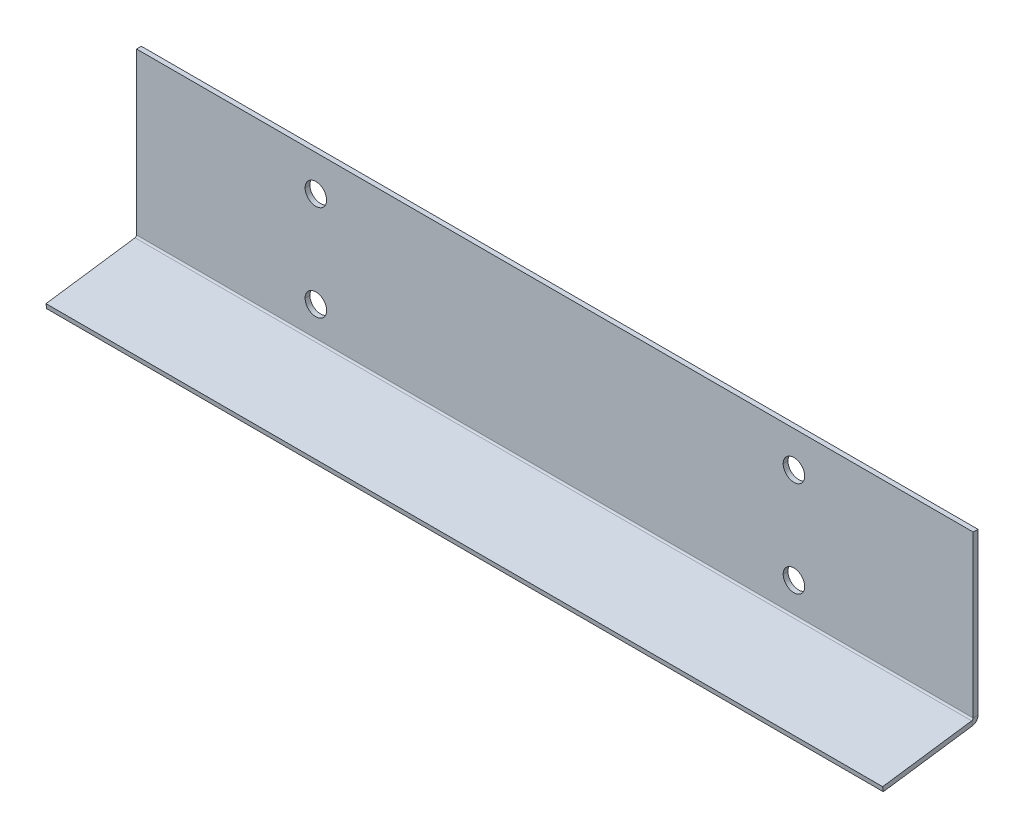
ISO-10303-21;
HEADER;
FILE_DESCRIPTION(('STEP AP214'),'2;1');
FILE_NAME('part.step','',(''),(''),'','','');
FILE_SCHEMA(('AUTOMOTIVE_DESIGN { 1 0 10303 214 1 1 1 1 }'));
ENDSEC;
DATA;
#1=APPLICATION_CONTEXT('core data for automotive mechanical design processes');
#2=APPLICATION_PROTOCOL_DEFINITION('international standard','automotive_design',2000,#1);
#3=PRODUCT_CONTEXT('',#1,'mechanical');
#4=PRODUCT('Part','Part','',(#3));
#5=PRODUCT_RELATED_PRODUCT_CATEGORY('part','',(#4));
#6=PRODUCT_DEFINITION_FORMATION('','',#4);
#7=PRODUCT_DEFINITION_CONTEXT('part definition',#1,'design');
#8=PRODUCT_DEFINITION('design','',#6,#7);
#9=PRODUCT_DEFINITION_SHAPE('','',#8);
#10=(LENGTH_UNIT() NAMED_UNIT(*) SI_UNIT(.MILLI.,.METRE.));
#11=(NAMED_UNIT(*) PLANE_ANGLE_UNIT() SI_UNIT($,.RADIAN.));
#12=(NAMED_UNIT(*) SI_UNIT($,.STERADIAN.) SOLID_ANGLE_UNIT());
#13=UNCERTAINTY_MEASURE_WITH_UNIT(LENGTH_MEASURE(1.E-05),#10,'distance_accuracy_value','');
#14=(GEOMETRIC_REPRESENTATION_CONTEXT(3) GLOBAL_UNCERTAINTY_ASSIGNED_CONTEXT((#13)) GLOBAL_UNIT_ASSIGNED_CONTEXT((#10,
#11,#12)) REPRESENTATION_CONTEXT('',''));
#15=CARTESIAN_POINT('',(0.,0.,0.));
#16=DIRECTION('',(0.,0.,1.));
#17=DIRECTION('',(1.,0.,0.));
#18=AXIS2_PLACEMENT_3D('',#15,#16,#17);
#19=CARTESIAN_POINT('',(-100.,20.,0.));
#20=DIRECTION('',(0.,0.,1.));
#21=DIRECTION('',(1.,0.,0.));
#22=AXIS2_PLACEMENT_3D('',#19,#20,#21);
#23=CYLINDRICAL_SURFACE('',#22,4.5);
#24=CARTESIAN_POINT('',(-100.,20.,-2.));
#25=DIRECTION('',(0.,0.,1.));
#26=DIRECTION('',(1.,0.,0.));
#27=AXIS2_PLACEMENT_3D('',#24,#25,#26);
#28=CIRCLE('',#27,4.5);
#29=CARTESIAN_POINT('',(-104.5,20.,-2.));
#30=VERTEX_POINT('',#29);
#31=CARTESIAN_POINT('',(-95.5,20.,-2.));
#32=VERTEX_POINT('',#31);
#33=EDGE_CURVE('E41',#30,#32,#28,.T.);
#34=ORIENTED_EDGE('',*,*,#33,.F.);
#35=DIRECTION('',(0.,0.,1.));
#36=VECTOR('',#35,1.);
#37=CARTESIAN_POINT('',(-104.5,20.,0.));
#38=LINE('',#37,#36);
#39=CARTESIAN_POINT('',(-104.5,20.,0.));
#40=VERTEX_POINT('',#39);
#41=EDGE_CURVE('E11',#30,#40,#38,.T.);
#42=ORIENTED_EDGE('',*,*,#41,.T.);
#43=CARTESIAN_POINT('',(-100.,20.,0.));
#44=DIRECTION('',(0.,0.,1.));
#45=DIRECTION('',(1.,0.,0.));
#46=AXIS2_PLACEMENT_3D('',#43,#44,#45);
#47=CIRCLE('',#46,4.5);
#48=CARTESIAN_POINT('',(-95.5,20.,0.));
#49=VERTEX_POINT('',#48);
#50=EDGE_CURVE('E27',#40,#49,#47,.T.);
#51=ORIENTED_EDGE('',*,*,#50,.T.);
#52=DIRECTION('',(0.,0.,1.));
#53=VECTOR('',#52,1.);
#54=CARTESIAN_POINT('',(-95.5,20.,0.));
#55=LINE('',#54,#53);
#56=EDGE_CURVE('E198',#32,#49,#55,.T.);
#57=ORIENTED_EDGE('',*,*,#56,.F.);
#58=EDGE_LOOP('',(#34,#42,#51,#57));
#59=FACE_BOUND('',#58,.T.);
#60=ADVANCED_FACE('F16',(#59),#23,.F.);
#61=CARTESIAN_POINT('',(-100.,-20.,0.));
#62=DIRECTION('',(0.,0.,1.));
#63=DIRECTION('',(1.,0.,0.));
#64=AXIS2_PLACEMENT_3D('',#61,#62,#63);
#65=CYLINDRICAL_SURFACE('',#64,4.5);
#66=CARTESIAN_POINT('',(-100.,-20.,-2.));
#67=DIRECTION('',(0.,0.,1.));
#68=DIRECTION('',(1.,0.,0.));
#69=AXIS2_PLACEMENT_3D('',#66,#67,#68);
#70=CIRCLE('',#69,4.5);
#71=CARTESIAN_POINT('',(-104.5,-20.,-2.));
#72=VERTEX_POINT('',#71);
#73=CARTESIAN_POINT('',(-95.5,-20.,-2.));
#74=VERTEX_POINT('',#73);
#75=EDGE_CURVE('E225',#72,#74,#70,.T.);
#76=ORIENTED_EDGE('',*,*,#75,.F.);
#77=DIRECTION('',(0.,0.,1.));
#78=VECTOR('',#77,1.);
#79=CARTESIAN_POINT('',(-104.5,-20.,0.));
#80=LINE('',#79,#78);
#81=CARTESIAN_POINT('',(-104.5,-20.,0.));
#82=VERTEX_POINT('',#81);
#83=EDGE_CURVE('E174',#72,#82,#80,.T.);
#84=ORIENTED_EDGE('',*,*,#83,.T.);
#85=CARTESIAN_POINT('',(-100.,-20.,0.));
#86=DIRECTION('',(0.,0.,1.));
#87=DIRECTION('',(1.,0.,0.));
#88=AXIS2_PLACEMENT_3D('',#85,#86,#87);
#89=CIRCLE('',#88,4.5);
#90=CARTESIAN_POINT('',(-95.5,-20.,0.));
#91=VERTEX_POINT('',#90);
#92=EDGE_CURVE('E178',#82,#91,#89,.T.);
#93=ORIENTED_EDGE('',*,*,#92,.T.);
#94=DIRECTION('',(0.,0.,1.));
#95=VECTOR('',#94,1.);
#96=CARTESIAN_POINT('',(-95.5,-20.,0.));
#97=LINE('',#96,#95);
#98=EDGE_CURVE('E197',#74,#91,#97,.T.);
#99=ORIENTED_EDGE('',*,*,#98,.F.);
#100=EDGE_LOOP('',(#76,#84,#93,#99));
#101=FACE_BOUND('',#100,.T.);
#102=ADVANCED_FACE('F647',(#101),#65,.F.);
#103=CARTESIAN_POINT('',(100.,-20.,0.));
#104=DIRECTION('',(0.,0.,1.));
#105=DIRECTION('',(1.,0.,0.));
#106=AXIS2_PLACEMENT_3D('',#103,#104,#105);
#107=CYLINDRICAL_SURFACE('',#106,4.5);
#108=CARTESIAN_POINT('',(100.,-20.,-2.));
#109=DIRECTION('',(0.,0.,1.));
#110=DIRECTION('',(1.,0.,0.));
#111=AXIS2_PLACEMENT_3D('',#108,#109,#110);
#112=CIRCLE('',#111,4.5);
#113=CARTESIAN_POINT('',(95.5,-20.,-2.));
#114=VERTEX_POINT('',#113);
#115=CARTESIAN_POINT('',(104.5,-20.,-2.));
#116=VERTEX_POINT('',#115);
#117=EDGE_CURVE('E226',#114,#116,#112,.T.);
#118=ORIENTED_EDGE('',*,*,#117,.F.);
#119=DIRECTION('',(0.,0.,1.));
#120=VECTOR('',#119,1.);
#121=CARTESIAN_POINT('',(95.5,-20.,0.));
#122=LINE('',#121,#120);
#123=CARTESIAN_POINT('',(95.5,-20.,0.));
#124=VERTEX_POINT('',#123);
#125=EDGE_CURVE('E182',#114,#124,#122,.T.);
#126=ORIENTED_EDGE('',*,*,#125,.T.);
#127=CARTESIAN_POINT('',(100.,-20.,0.));
#128=DIRECTION('',(0.,0.,1.));
#129=DIRECTION('',(1.,0.,0.));
#130=AXIS2_PLACEMENT_3D('',#127,#128,#129);
#131=CIRCLE('',#130,4.5);
#132=CARTESIAN_POINT('',(104.5,-20.,0.));
#133=VERTEX_POINT('',#132);
#134=EDGE_CURVE('E179',#124,#133,#131,.T.);
#135=ORIENTED_EDGE('',*,*,#134,.T.);
#136=DIRECTION('',(0.,0.,1.));
#137=VECTOR('',#136,1.);
#138=CARTESIAN_POINT('',(104.5,-20.,0.));
#139=LINE('',#138,#137);
#140=EDGE_CURVE('E217',#116,#133,#139,.T.);
#141=ORIENTED_EDGE('',*,*,#140,.F.);
#142=EDGE_LOOP('',(#118,#126,#135,#141));
#143=FACE_BOUND('',#142,.T.);
#144=ADVANCED_FACE('F18',(#143),#107,.F.);
#145=CARTESIAN_POINT('',(100.,20.,0.));
#146=DIRECTION('',(0.,0.,1.));
#147=DIRECTION('',(1.,0.,0.));
#148=AXIS2_PLACEMENT_3D('',#145,#146,#147);
#149=CYLINDRICAL_SURFACE('',#148,4.5);
#150=CARTESIAN_POINT('',(100.,20.,-2.));
#151=DIRECTION('',(0.,0.,1.));
#152=DIRECTION('',(1.,0.,0.));
#153=AXIS2_PLACEMENT_3D('',#150,#151,#152);
#154=CIRCLE('',#153,4.5);
#155=CARTESIAN_POINT('',(95.5,20.,-2.));
#156=VERTEX_POINT('',#155);
#157=CARTESIAN_POINT('',(104.5,20.,-2.));
#158=VERTEX_POINT('',#157);
#159=EDGE_CURVE('E187',#156,#158,#154,.T.);
#160=ORIENTED_EDGE('',*,*,#159,.F.);
#161=DIRECTION('',(0.,0.,1.));
#162=VECTOR('',#161,1.);
#163=CARTESIAN_POINT('',(95.5,20.,0.));
#164=LINE('',#163,#162);
#165=CARTESIAN_POINT('',(95.5,20.,0.));
#166=VERTEX_POINT('',#165);
#167=EDGE_CURVE('E183',#156,#166,#164,.T.);
#168=ORIENTED_EDGE('',*,*,#167,.T.);
#169=CARTESIAN_POINT('',(100.,20.,0.));
#170=DIRECTION('',(0.,0.,1.));
#171=DIRECTION('',(1.,0.,0.));
#172=AXIS2_PLACEMENT_3D('',#169,#170,#171);
#173=CIRCLE('',#172,4.5);
#174=CARTESIAN_POINT('',(104.5,20.,0.));
#175=VERTEX_POINT('',#174);
#176=EDGE_CURVE('E203',#166,#175,#173,.T.);
#177=ORIENTED_EDGE('',*,*,#176,.T.);
#178=DIRECTION('',(0.,0.,1.));
#179=VECTOR('',#178,1.);
#180=CARTESIAN_POINT('',(104.5,20.,0.));
#181=LINE('',#180,#179);
#182=EDGE_CURVE('E167',#158,#175,#181,.T.);
#183=ORIENTED_EDGE('',*,*,#182,.F.);
#184=EDGE_LOOP('',(#160,#168,#177,#183));
#185=FACE_BOUND('',#184,.T.);
#186=ADVANCED_FACE('F601',(#185),#149,.F.);
#187=CARTESIAN_POINT('',(175.,-35.,-2.));
#188=DIRECTION('',(1.,0.,0.));
#189=DIRECTION('',(0.,1.,0.));
#190=AXIS2_PLACEMENT_3D('',#187,#188,#189);
#191=PLANE('',#190);
#192=DIRECTION('',(0.,1.,0.));
#193=VECTOR('',#192,1.);
#194=CARTESIAN_POINT('',(175.,-35.,0.));
#195=LINE('',#194,#193);
#196=CARTESIAN_POINT('',(175.,-32.3400282438874,0.));
#197=VERTEX_POINT('',#196);
#198=CARTESIAN_POINT('',(175.,35.,0.));
#199=VERTEX_POINT('',#198);
#200=EDGE_CURVE('E188',#197,#199,#195,.T.);
#201=ORIENTED_EDGE('',*,*,#200,.F.);
#202=DIRECTION('',(0.,0.,-1.));
#203=VECTOR('',#202,1.);
#204=CARTESIAN_POINT('',(175.,-32.3400282438874,0.));
#205=LINE('',#204,#203);
#206=CARTESIAN_POINT('',(175.,-32.3400282438873,-2.));
#207=VERTEX_POINT('',#206);
#208=EDGE_CURVE('E199',#197,#207,#205,.T.);
#209=ORIENTED_EDGE('',*,*,#208,.T.);
#210=DIRECTION('',(0.,1.,0.));
#211=VECTOR('',#210,1.);
#212=CARTESIAN_POINT('',(175.,-35.,-2.));
#213=LINE('',#212,#211);
#214=CARTESIAN_POINT('',(175.,35.,-2.));
#215=VERTEX_POINT('',#214);
#216=EDGE_CURVE('E204',#207,#215,#213,.T.);
#217=ORIENTED_EDGE('',*,*,#216,.T.);
#218=DIRECTION('',(0.,0.,1.));
#219=VECTOR('',#218,1.);
#220=CARTESIAN_POINT('',(175.,35.,-2.));
#221=LINE('',#220,#219);
#222=EDGE_CURVE('E133',#215,#199,#221,.T.);
#223=ORIENTED_EDGE('',*,*,#222,.T.);
#224=EDGE_LOOP('',(#201,#209,#217,#223));
#225=FACE_BOUND('',#224,.T.);
#226=ADVANCED_FACE('F281',(#225),#191,.T.);
#227=CARTESIAN_POINT('',(0.,0.,-2.));
#228=DIRECTION('',(0.,0.,1.));
#229=DIRECTION('',(1.,0.,0.));
#230=AXIS2_PLACEMENT_3D('',#227,#228,#229);
#231=PLANE('',#230);
#232=DIRECTION('',(-1.,0.,0.));
#233=VECTOR('',#232,1.);
#234=CARTESIAN_POINT('',(175.,-32.3400282438873,-2.));
#235=LINE('',#234,#233);
#236=CARTESIAN_POINT('',(-175.,-32.3400282438874,-2.));
#237=VERTEX_POINT('',#236);
#238=EDGE_CURVE('E145',#207,#237,#235,.T.);
#239=ORIENTED_EDGE('',*,*,#238,.T.);
#240=DIRECTION('',(0.,-1.,0.));
#241=VECTOR('',#240,1.);
#242=CARTESIAN_POINT('',(-175.,-35.,-2.));
#243=LINE('',#242,#241);
#244=CARTESIAN_POINT('',(-175.,35.,-2.));
#245=VERTEX_POINT('',#244);
#246=EDGE_CURVE('E138',#245,#237,#243,.T.);
#247=ORIENTED_EDGE('',*,*,#246,.F.);
#248=DIRECTION('',(-1.,0.,0.));
#249=VECTOR('',#248,1.);
#250=CARTESIAN_POINT('',(175.,35.,-2.));
#251=LINE('',#250,#249);
#252=EDGE_CURVE('E126',#215,#245,#251,.T.);
#253=ORIENTED_EDGE('',*,*,#252,.F.);
#254=ORIENTED_EDGE('',*,*,#216,.F.);
#255=EDGE_LOOP('',(#239,#247,#253,#254));
#256=FACE_BOUND('',#255,.T.);
#257=CARTESIAN_POINT('',(-100.,20.,-2.));
#258=DIRECTION('',(0.,0.,1.));
#259=DIRECTION('',(1.,0.,0.));
#260=AXIS2_PLACEMENT_3D('',#257,#258,#259);
#261=CIRCLE('',#260,4.5);
#262=EDGE_CURVE('E263',#32,#30,#261,.T.);
#263=ORIENTED_EDGE('',*,*,#262,.T.);
#264=ORIENTED_EDGE('',*,*,#33,.T.);
#265=EDGE_LOOP('',(#263,#264));
#266=FACE_BOUND('',#265,.T.);
#267=CARTESIAN_POINT('',(-100.,-20.,-2.));
#268=DIRECTION('',(0.,0.,1.));
#269=DIRECTION('',(1.,0.,0.));
#270=AXIS2_PLACEMENT_3D('',#267,#268,#269);
#271=CIRCLE('',#270,4.5);
#272=EDGE_CURVE('E266',#74,#72,#271,.T.);
#273=ORIENTED_EDGE('',*,*,#272,.T.);
#274=ORIENTED_EDGE('',*,*,#75,.T.);
#275=EDGE_LOOP('',(#273,#274));
#276=FACE_BOUND('',#275,.T.);
#277=CARTESIAN_POINT('',(100.,-20.,-2.));
#278=DIRECTION('',(0.,0.,1.));
#279=DIRECTION('',(1.,0.,0.));
#280=AXIS2_PLACEMENT_3D('',#277,#278,#279);
#281=CIRCLE('',#280,4.5);
#282=EDGE_CURVE('E221',#116,#114,#281,.T.);
#283=ORIENTED_EDGE('',*,*,#282,.T.);
#284=ORIENTED_EDGE('',*,*,#117,.T.);
#285=EDGE_LOOP('',(#283,#284));
#286=FACE_BOUND('',#285,.T.);
#287=CARTESIAN_POINT('',(100.,20.,-2.));
#288=DIRECTION('',(0.,0.,1.));
#289=DIRECTION('',(1.,0.,0.));
#290=AXIS2_PLACEMENT_3D('',#287,#288,#289);
#291=CIRCLE('',#290,4.5);
#292=EDGE_CURVE('E245',#158,#156,#291,.T.);
#293=ORIENTED_EDGE('',*,*,#292,.T.);
#294=ORIENTED_EDGE('',*,*,#159,.T.);
#295=EDGE_LOOP('',(#293,#294));
#296=FACE_BOUND('',#295,.T.);
#297=ADVANCED_FACE('F142',(#256,#266,#276,#286,#296),#231,.F.);
#298=CARTESIAN_POINT('',(0.,0.,0.));
#299=DIRECTION('',(0.,0.,1.));
#300=DIRECTION('',(1.,0.,0.));
#301=AXIS2_PLACEMENT_3D('',#298,#299,#300);
#302=PLANE('',#301);
#303=DIRECTION('',(0.,-1.,0.));
#304=VECTOR('',#303,1.);
#305=CARTESIAN_POINT('',(-175.,-35.,0.));
#306=LINE('',#305,#304);
#307=CARTESIAN_POINT('',(-175.,35.,0.));
#308=VERTEX_POINT('',#307);
#309=CARTESIAN_POINT('',(-175.,-32.3400282438874,0.));
#310=VERTEX_POINT('',#309);
#311=EDGE_CURVE('E155',#308,#310,#306,.T.);
#312=ORIENTED_EDGE('',*,*,#311,.T.);
#313=DIRECTION('',(-1.,0.,0.));
#314=VECTOR('',#313,1.);
#315=CARTESIAN_POINT('',(175.,-32.3400282438874,0.));
#316=LINE('',#315,#314);
#317=EDGE_CURVE('E169',#197,#310,#316,.T.);
#318=ORIENTED_EDGE('',*,*,#317,.F.);
#319=ORIENTED_EDGE('',*,*,#200,.T.);
#320=DIRECTION('',(-1.,0.,0.));
#321=VECTOR('',#320,1.);
#322=CARTESIAN_POINT('',(175.,35.,0.));
#323=LINE('',#322,#321);
#324=EDGE_CURVE('E150',#199,#308,#323,.T.);
#325=ORIENTED_EDGE('',*,*,#324,.T.);
#326=EDGE_LOOP('',(#312,#318,#319,#325));
#327=FACE_BOUND('',#326,.T.);
#328=CARTESIAN_POINT('',(-100.,20.,0.));
#329=DIRECTION('',(0.,0.,1.));
#330=DIRECTION('',(1.,0.,0.));
#331=AXIS2_PLACEMENT_3D('',#328,#329,#330);
#332=CIRCLE('',#331,4.5);
#333=EDGE_CURVE('E252',#49,#40,#332,.T.);
#334=ORIENTED_EDGE('',*,*,#333,.F.);
#335=ORIENTED_EDGE('',*,*,#50,.F.);
#336=EDGE_LOOP('',(#334,#335));
#337=FACE_BOUND('',#336,.T.);
#338=CARTESIAN_POINT('',(-100.,-20.,0.));
#339=DIRECTION('',(0.,0.,1.));
#340=DIRECTION('',(1.,0.,0.));
#341=AXIS2_PLACEMENT_3D('',#338,#339,#340);
#342=CIRCLE('',#341,4.5);
#343=EDGE_CURVE('E193',#91,#82,#342,.T.);
#344=ORIENTED_EDGE('',*,*,#343,.F.);
#345=ORIENTED_EDGE('',*,*,#92,.F.);
#346=EDGE_LOOP('',(#344,#345));
#347=FACE_BOUND('',#346,.T.);
#348=CARTESIAN_POINT('',(100.,-20.,0.));
#349=DIRECTION('',(0.,0.,1.));
#350=DIRECTION('',(1.,0.,0.));
#351=AXIS2_PLACEMENT_3D('',#348,#349,#350);
#352=CIRCLE('',#351,4.5);
#353=EDGE_CURVE('E213',#133,#124,#352,.T.);
#354=ORIENTED_EDGE('',*,*,#353,.F.);
#355=ORIENTED_EDGE('',*,*,#134,.F.);
#356=EDGE_LOOP('',(#354,#355));
#357=FACE_BOUND('',#356,.T.);
#358=CARTESIAN_POINT('',(100.,20.,0.));
#359=DIRECTION('',(0.,0.,1.));
#360=DIRECTION('',(1.,0.,0.));
#361=AXIS2_PLACEMENT_3D('',#358,#359,#360);
#362=CIRCLE('',#361,4.5);
#363=EDGE_CURVE('E313',#175,#166,#362,.T.);
#364=ORIENTED_EDGE('',*,*,#363,.F.);
#365=ORIENTED_EDGE('',*,*,#176,.F.);
#366=EDGE_LOOP('',(#364,#365));
#367=FACE_BOUND('',#366,.T.);
#368=ADVANCED_FACE('F277',(#327,#337,#347,#357,#367),#302,.T.);
#369=CARTESIAN_POINT('',(-175.,-35.,-2.));
#370=DIRECTION('',(-1.,0.,0.));
#371=DIRECTION('',(0.,0.,1.));
#372=AXIS2_PLACEMENT_3D('',#369,#370,#371);
#373=PLANE('',#372);
#374=DIRECTION('',(0.,0.,-1.));
#375=VECTOR('',#374,1.);
#376=CARTESIAN_POINT('',(-175.,-32.3400282438874,0.));
#377=LINE('',#376,#375);
#378=EDGE_CURVE('E157',#310,#237,#377,.T.);
#379=ORIENTED_EDGE('',*,*,#378,.F.);
#380=ORIENTED_EDGE('',*,*,#311,.F.);
#381=DIRECTION('',(0.,0.,1.));
#382=VECTOR('',#381,1.);
#383=CARTESIAN_POINT('',(-175.,35.,-2.));
#384=LINE('',#383,#382);
#385=EDGE_CURVE('E131',#245,#308,#384,.T.);
#386=ORIENTED_EDGE('',*,*,#385,.F.);
#387=ORIENTED_EDGE('',*,*,#246,.T.);
#388=EDGE_LOOP('',(#379,#380,#386,#387));
#389=FACE_BOUND('',#388,.T.);
#390=ADVANCED_FACE('F153',(#389),#373,.T.);
#391=CARTESIAN_POINT('',(175.,35.,-2.));
#392=DIRECTION('',(0.,1.,0.));
#393=DIRECTION('',(1.,0.,0.));
#394=AXIS2_PLACEMENT_3D('',#391,#392,#393);
#395=PLANE('',#394);
#396=ORIENTED_EDGE('',*,*,#324,.F.);
#397=ORIENTED_EDGE('',*,*,#222,.F.);
#398=ORIENTED_EDGE('',*,*,#252,.T.);
#399=ORIENTED_EDGE('',*,*,#385,.T.);
#400=EDGE_LOOP('',(#396,#397,#398,#399));
#401=FACE_BOUND('',#400,.T.);
#402=ADVANCED_FACE('F129',(#401),#395,.T.);
#403=CARTESIAN_POINT('',(-175.,-32.3400282438874,0.736599999999989));
#404=DIRECTION('',(-1.,0.,0.));
#405=DIRECTION('',(0.,0.,1.));
#406=AXIS2_PLACEMENT_3D('',#403,#404,#405);
#407=PLANE('',#406);
#408=DIRECTION('',(0.,-0.99026806874157,-0.139173100960069));
#409=VECTOR('',#408,1.);
#410=CARTESIAN_POINT('',(-175.,-35.0499958408056,0.355738891912671));
#411=LINE('',#410,#409);
#412=CARTESIAN_POINT('',(-175.,-33.0694597033225,0.634085093832799));
#413=VERTEX_POINT('',#412);
#414=CARTESIAN_POINT('',(-175.,-35.0499958408056,0.355738891912661));
#415=VERTEX_POINT('',#414);
#416=EDGE_CURVE('E244',#413,#415,#411,.T.);
#417=ORIENTED_EDGE('',*,*,#416,.F.);
#418=CARTESIAN_POINT('',(-175.,-32.3400282438874,0.736599999999989));
#419=DIRECTION('',(-1.,0.,0.));
#420=DIRECTION('',(0.,0.,-1.));
#421=AXIS2_PLACEMENT_3D('',#418,#419,#420);
#422=CIRCLE('',#421,0.736600000000021);
#423=EDGE_CURVE('E173',#310,#413,#422,.T.);
#424=ORIENTED_EDGE('',*,*,#423,.F.);
#425=ORIENTED_EDGE('',*,*,#378,.T.);
#426=CARTESIAN_POINT('',(-175.,-32.3400282438874,0.736599999999989));
#427=DIRECTION('',(-1.,0.,0.));
#428=DIRECTION('',(0.,0.,-1.));
#429=AXIS2_PLACEMENT_3D('',#426,#427,#428);
#430=CIRCLE('',#429,2.7366);
#431=EDGE_CURVE('E163',#237,#415,#430,.T.);
#432=ORIENTED_EDGE('',*,*,#431,.T.);
#433=EDGE_LOOP('',(#417,#424,#425,#432));
#434=FACE_BOUND('',#433,.T.);
#435=ADVANCED_FACE('F364',(#434),#407,.T.);
#436=CARTESIAN_POINT('',(175.,-32.3400282438874,0.736600000000015));
#437=DIRECTION('',(-1.,0.,0.));
#438=DIRECTION('',(0.,0.,1.));
#439=AXIS2_PLACEMENT_3D('',#436,#437,#438);
#440=PLANE('',#439);
#441=CARTESIAN_POINT('',(175.,-32.3400282438874,0.736600000000015));
#442=DIRECTION('',(1.,0.,0.));
#443=DIRECTION('',(0.,0.,-1.));
#444=AXIS2_PLACEMENT_3D('',#441,#442,#443);
#445=CIRCLE('',#444,0.736600000000021);
#446=CARTESIAN_POINT('',(175.,-33.0694597033225,0.634085093832825));
#447=VERTEX_POINT('',#446);
#448=EDGE_CURVE('E239',#447,#197,#445,.T.);
#449=ORIENTED_EDGE('',*,*,#448,.F.);
#450=DIRECTION('',(0.,-0.99026806874157,-0.139173100960069));
#451=VECTOR('',#450,1.);
#452=CARTESIAN_POINT('',(175.,-33.0694597033223,0.634085093832823));
#453=LINE('',#452,#451);
#454=CARTESIAN_POINT('',(175.,-35.0499958408056,0.355738891912683));
#455=VERTEX_POINT('',#454);
#456=EDGE_CURVE('E20',#447,#455,#453,.T.);
#457=ORIENTED_EDGE('',*,*,#456,.T.);
#458=CARTESIAN_POINT('',(175.,-32.3400282438874,0.736600000000015));
#459=DIRECTION('',(1.,0.,0.));
#460=DIRECTION('',(0.,0.,-1.));
#461=AXIS2_PLACEMENT_3D('',#458,#459,#460);
#462=CIRCLE('',#461,2.7366);
#463=EDGE_CURVE('E189',#455,#207,#462,.T.);
#464=ORIENTED_EDGE('',*,*,#463,.T.);
#465=ORIENTED_EDGE('',*,*,#208,.F.);
#466=EDGE_LOOP('',(#449,#457,#464,#465));
#467=FACE_BOUND('',#466,.T.);
#468=ADVANCED_FACE('F746',(#467),#440,.F.);
#469=CARTESIAN_POINT('',(175.,-32.3400282438874,0.736600000000015));
#470=DIRECTION('',(1.,0.,0.));
#471=DIRECTION('',(0.,-0.99026806874157,-0.139173100960069));
#472=AXIS2_PLACEMENT_3D('',#469,#470,#471);
#473=CYLINDRICAL_SURFACE('',#472,2.7366);
#474=ORIENTED_EDGE('',*,*,#238,.F.);
#475=ORIENTED_EDGE('',*,*,#463,.F.);
#476=DIRECTION('',(-1.,0.,0.));
#477=VECTOR('',#476,1.);
#478=CARTESIAN_POINT('',(-175.,-35.0499958408056,0.355738891912669));
#479=LINE('',#478,#477);
#480=EDGE_CURVE('E172',#455,#415,#479,.T.);
#481=ORIENTED_EDGE('',*,*,#480,.T.);
#482=ORIENTED_EDGE('',*,*,#431,.F.);
#483=EDGE_LOOP('',(#474,#475,#481,#482));
#484=FACE_BOUND('',#483,.T.);
#485=ADVANCED_FACE('F655',(#484),#473,.T.);
#486=CARTESIAN_POINT('',(175.,-32.3400282438874,0.736600000000015));
#487=DIRECTION('',(1.,0.,0.));
#488=DIRECTION('',(0.,-0.99026806874157,-0.139173100960069));
#489=AXIS2_PLACEMENT_3D('',#486,#487,#488);
#490=CYLINDRICAL_SURFACE('',#489,0.736600000000022);
#491=ORIENTED_EDGE('',*,*,#317,.T.);
#492=ORIENTED_EDGE('',*,*,#423,.T.);
#493=DIRECTION('',(1.,0.,0.));
#494=VECTOR('',#493,1.);
#495=CARTESIAN_POINT('',(-175.,-33.0694597033224,0.634085093832809));
#496=LINE('',#495,#494);
#497=EDGE_CURVE('E243',#413,#447,#496,.T.);
#498=ORIENTED_EDGE('',*,*,#497,.T.);
#499=ORIENTED_EDGE('',*,*,#448,.T.);
#500=EDGE_LOOP('',(#491,#492,#498,#499));
#501=FACE_BOUND('',#500,.T.);
#502=ADVANCED_FACE('F375',(#501),#490,.F.);
#503=CARTESIAN_POINT('',(-175.,-34.9608809924459,-0.278346201920138));
#504=DIRECTION('',(1.,0.,0.));
#505=DIRECTION('',(0.,1.,0.));
#506=AXIS2_PLACEMENT_3D('',#503,#504,#505);
#507=PLANE('',#506);
#508=ORIENTED_EDGE('',*,*,#416,.T.);
#509=DIRECTION('',(0.,0.139173100960069,-0.99026806874157));
#510=VECTOR('',#509,1.);
#511=CARTESIAN_POINT('',(-175.,-34.2829606713665,-5.10199992871776));
#512=LINE('',#511,#510);
#513=CARTESIAN_POINT('',(-175.,-40.285842368998,37.6107227496628));
#514=VERTEX_POINT('',#513);
#515=EDGE_CURVE('E227',#514,#415,#512,.T.);
#516=ORIENTED_EDGE('',*,*,#515,.F.);
#517=DIRECTION('',(0.,0.99026806874157,0.139173100960069));
#518=VECTOR('',#517,1.);
#519=CARTESIAN_POINT('',(-175.,-40.285842368998,37.6107227496628));
#520=LINE('',#519,#518);
#521=CARTESIAN_POINT('',(-175.,-38.3053062315149,37.889068951583));
#522=VERTEX_POINT('',#521);
#523=EDGE_CURVE('E295',#514,#522,#520,.T.);
#524=ORIENTED_EDGE('',*,*,#523,.T.);
#525=DIRECTION('',(0.,0.139173100960069,-0.99026806874157));
#526=VECTOR('',#525,1.);
#527=CARTESIAN_POINT('',(-175.,-32.9803448549628,0.));
#528=LINE('',#527,#526);
#529=EDGE_CURVE('E235',#522,#413,#528,.T.);
#530=ORIENTED_EDGE('',*,*,#529,.T.);
#531=EDGE_LOOP('',(#508,#516,#524,#530));
#532=FACE_BOUND('',#531,.T.);
#533=ADVANCED_FACE('F376',(#532),#507,.F.);
#534=CARTESIAN_POINT('',(175.,-40.285842368998,37.6107227496628));
#535=DIRECTION('',(-1.,0.,0.));
#536=DIRECTION('',(0.,1.,0.));
#537=AXIS2_PLACEMENT_3D('',#534,#535,#536);
#538=PLANE('',#537);
#539=ORIENTED_EDGE('',*,*,#456,.F.);
#540=DIRECTION('',(0.,-0.139173100960069,0.99026806874157));
#541=VECTOR('',#540,1.);
#542=CARTESIAN_POINT('',(175.,-38.3053062315149,37.889068951583));
#543=LINE('',#542,#541);
#544=CARTESIAN_POINT('',(175.,-38.3053062315149,37.889068951583));
#545=VERTEX_POINT('',#544);
#546=EDGE_CURVE('E211',#447,#545,#543,.T.);
#547=ORIENTED_EDGE('',*,*,#546,.T.);
#548=DIRECTION('',(0.,0.99026806874157,0.139173100960069));
#549=VECTOR('',#548,1.);
#550=CARTESIAN_POINT('',(175.,-40.285842368998,37.6107227496628));
#551=LINE('',#550,#549);
#552=CARTESIAN_POINT('',(175.,-40.285842368998,37.6107227496628));
#553=VERTEX_POINT('',#552);
#554=EDGE_CURVE('E236',#553,#545,#551,.T.);
#555=ORIENTED_EDGE('',*,*,#554,.F.);
#556=DIRECTION('',(0.,-0.139173100960069,0.99026806874157));
#557=VECTOR('',#556,1.);
#558=CARTESIAN_POINT('',(175.,-34.2829606713665,-5.10199992871775));
#559=LINE('',#558,#557);
#560=EDGE_CURVE('E207',#455,#553,#559,.T.);
#561=ORIENTED_EDGE('',*,*,#560,.F.);
#562=EDGE_LOOP('',(#539,#547,#555,#561));
#563=FACE_BOUND('',#562,.T.);
#564=ADVANCED_FACE('F387',(#563),#538,.F.);
#565=CARTESIAN_POINT('',(0.,-34.2829606713665,-5.10199992871776));
#566=DIRECTION('',(0.,0.99026806874157,0.139173100960069));
#567=DIRECTION('',(1.,0.,0.));
#568=AXIS2_PLACEMENT_3D('',#565,#566,#567);
#569=PLANE('',#568);
#570=ORIENTED_EDGE('',*,*,#480,.F.);
#571=ORIENTED_EDGE('',*,*,#560,.T.);
#572=DIRECTION('',(-1.,0.,0.));
#573=VECTOR('',#572,1.);
#574=CARTESIAN_POINT('',(0.,-40.285842368998,37.6107227496628));
#575=LINE('',#574,#573);
#576=EDGE_CURVE('E212',#553,#514,#575,.T.);
#577=ORIENTED_EDGE('',*,*,#576,.T.);
#578=ORIENTED_EDGE('',*,*,#515,.T.);
#579=EDGE_LOOP('',(#570,#571,#577,#578));
#580=FACE_BOUND('',#579,.T.);
#581=ADVANCED_FACE('F721',(#580),#569,.F.);
#582=CARTESIAN_POINT('',(0.,-32.3024245338834,-4.82365372679762));
#583=DIRECTION('',(0.,0.99026806874157,0.139173100960069));
#584=DIRECTION('',(1.,0.,0.));
#585=AXIS2_PLACEMENT_3D('',#582,#583,#584);
#586=PLANE('',#585);
#587=ORIENTED_EDGE('',*,*,#546,.F.);
#588=ORIENTED_EDGE('',*,*,#497,.F.);
#589=ORIENTED_EDGE('',*,*,#529,.F.);
#590=DIRECTION('',(-1.,0.,0.));
#591=VECTOR('',#590,1.);
#592=CARTESIAN_POINT('',(-175.,-38.3053062315149,37.889068951583));
#593=LINE('',#592,#591);
#594=EDGE_CURVE('E231',#545,#522,#593,.T.);
#595=ORIENTED_EDGE('',*,*,#594,.F.);
#596=EDGE_LOOP('',(#587,#588,#589,#595));
#597=FACE_BOUND('',#596,.T.);
#598=ADVANCED_FACE('F370',(#597),#586,.T.);
#599=CARTESIAN_POINT('',(-175.,-40.285842368998,37.6107227496628));
#600=DIRECTION('',(0.,0.139173100960069,-0.99026806874157));
#601=DIRECTION('',(-1.,0.,0.));
#602=AXIS2_PLACEMENT_3D('',#599,#600,#601);
#603=PLANE('',#602);
#604=ORIENTED_EDGE('',*,*,#594,.T.);
#605=ORIENTED_EDGE('',*,*,#523,.F.);
#606=ORIENTED_EDGE('',*,*,#576,.F.);
#607=ORIENTED_EDGE('',*,*,#554,.T.);
#608=EDGE_LOOP('',(#604,#605,#606,#607));
#609=FACE_BOUND('',#608,.T.);
#610=ADVANCED_FACE('F383',(#609),#603,.F.);
#611=CARTESIAN_POINT('',(100.,20.,0.));
#612=DIRECTION('',(0.,0.,1.));
#613=DIRECTION('',(1.,0.,0.));
#614=AXIS2_PLACEMENT_3D('',#611,#612,#613);
#615=CYLINDRICAL_SURFACE('',#614,4.5);
#616=ORIENTED_EDGE('',*,*,#167,.F.);
#617=ORIENTED_EDGE('',*,*,#292,.F.);
#618=ORIENTED_EDGE('',*,*,#182,.T.);
#619=ORIENTED_EDGE('',*,*,#363,.T.);
#620=EDGE_LOOP('',(#616,#617,#618,#619));
#621=FACE_BOUND('',#620,.T.);
#622=ADVANCED_FACE('F605',(#621),#615,.F.);
#623=CARTESIAN_POINT('',(100.,-20.,0.));
#624=DIRECTION('',(0.,0.,1.));
#625=DIRECTION('',(1.,0.,0.));
#626=AXIS2_PLACEMENT_3D('',#623,#624,#625);
#627=CYLINDRICAL_SURFACE('',#626,4.5);
#628=ORIENTED_EDGE('',*,*,#125,.F.);
#629=ORIENTED_EDGE('',*,*,#282,.F.);
#630=ORIENTED_EDGE('',*,*,#140,.T.);
#631=ORIENTED_EDGE('',*,*,#353,.T.);
#632=EDGE_LOOP('',(#628,#629,#630,#631));
#633=FACE_BOUND('',#632,.T.);
#634=ADVANCED_FACE('F633',(#633),#627,.F.);
#635=CARTESIAN_POINT('',(-100.,-20.,0.));
#636=DIRECTION('',(0.,0.,1.));
#637=DIRECTION('',(1.,0.,0.));
#638=AXIS2_PLACEMENT_3D('',#635,#636,#637);
#639=CYLINDRICAL_SURFACE('',#638,4.5);
#640=ORIENTED_EDGE('',*,*,#83,.F.);
#641=ORIENTED_EDGE('',*,*,#272,.F.);
#642=ORIENTED_EDGE('',*,*,#98,.T.);
#643=ORIENTED_EDGE('',*,*,#343,.T.);
#644=EDGE_LOOP('',(#640,#641,#642,#643));
#645=FACE_BOUND('',#644,.T.);
#646=ADVANCED_FACE('F732',(#645),#639,.F.);
#647=CARTESIAN_POINT('',(-100.,20.,0.));
#648=DIRECTION('',(0.,0.,1.));
#649=DIRECTION('',(1.,0.,0.));
#650=AXIS2_PLACEMENT_3D('',#647,#648,#649);
#651=CYLINDRICAL_SURFACE('',#650,4.5);
#652=ORIENTED_EDGE('',*,*,#41,.F.);
#653=ORIENTED_EDGE('',*,*,#262,.F.);
#654=ORIENTED_EDGE('',*,*,#56,.T.);
#655=ORIENTED_EDGE('',*,*,#333,.T.);
#656=EDGE_LOOP('',(#652,#653,#654,#655));
#657=FACE_BOUND('',#656,.T.);
#658=ADVANCED_FACE('F334',(#657),#651,.F.);
#659=CLOSED_SHELL('',(#60,#102,#144,#186,#226,#297,#368,#390,#402,#435,#468,#485,#502,#533,#564,
#581,#598,#610,#622,#634,#646,#658));
#660=MANIFOLD_SOLID_BREP('B1',#659);
#661=ADVANCED_BREP_SHAPE_REPRESENTATION('',(#18,#660),#14);
#662=SHAPE_DEFINITION_REPRESENTATION(#9,#661);
ENDSEC;
END-ISO-10303-21;
